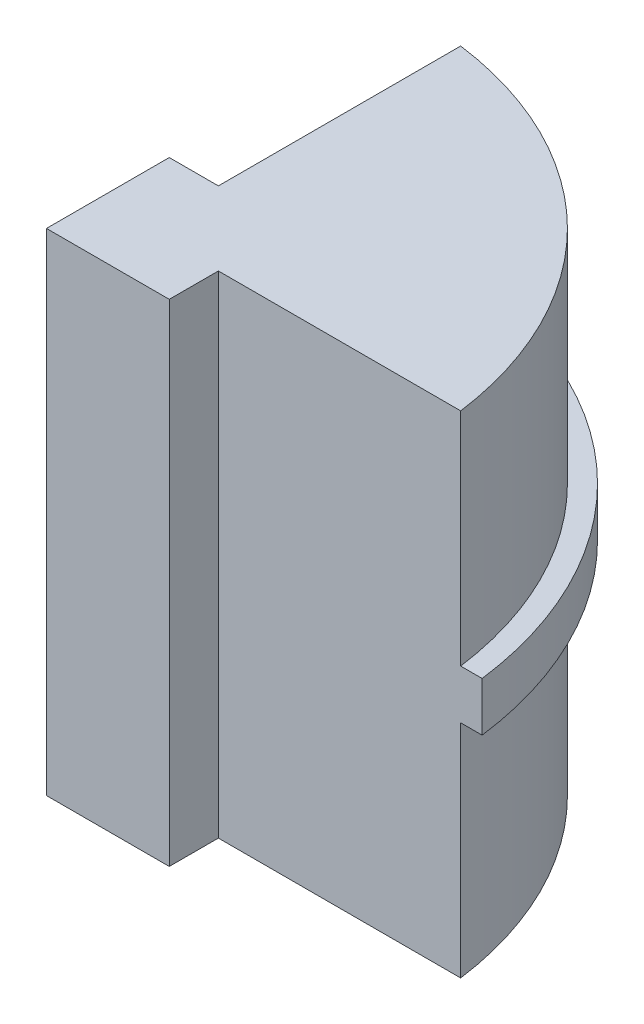
ISO-10303-21;
HEADER;
FILE_DESCRIPTION(('STEP AP214'),'2;1');
FILE_NAME('part.step','',(''),(''),'','','');
FILE_SCHEMA(('AUTOMOTIVE_DESIGN { 1 0 10303 214 1 1 1 1 }'));
ENDSEC;
DATA;
#1=APPLICATION_CONTEXT('core data for automotive mechanical design processes');
#2=APPLICATION_PROTOCOL_DEFINITION('international standard','automotive_design',2000,#1);
#3=PRODUCT_CONTEXT('',#1,'mechanical');
#4=PRODUCT('Part','Part','',(#3));
#5=PRODUCT_RELATED_PRODUCT_CATEGORY('part','',(#4));
#6=PRODUCT_DEFINITION_FORMATION('','',#4);
#7=PRODUCT_DEFINITION_CONTEXT('part definition',#1,'design');
#8=PRODUCT_DEFINITION('design','',#6,#7);
#9=PRODUCT_DEFINITION_SHAPE('','',#8);
#10=(LENGTH_UNIT() NAMED_UNIT(*) SI_UNIT(.MILLI.,.METRE.));
#11=(NAMED_UNIT(*) PLANE_ANGLE_UNIT() SI_UNIT($,.RADIAN.));
#12=(NAMED_UNIT(*) SI_UNIT($,.STERADIAN.) SOLID_ANGLE_UNIT());
#13=UNCERTAINTY_MEASURE_WITH_UNIT(LENGTH_MEASURE(1.E-05),#10,'distance_accuracy_value','');
#14=(GEOMETRIC_REPRESENTATION_CONTEXT(3) GLOBAL_UNCERTAINTY_ASSIGNED_CONTEXT((#13)) GLOBAL_UNIT_ASSIGNED_CONTEXT((#10,
#11,#12)) REPRESENTATION_CONTEXT('',''));
#15=CARTESIAN_POINT('',(0.,0.,0.));
#16=DIRECTION('',(0.,0.,1.));
#17=DIRECTION('',(1.,0.,0.));
#18=AXIS2_PLACEMENT_3D('',#15,#16,#17);
#19=CARTESIAN_POINT('',(-78.3830225784405,100.,48.6501613768879));
#20=DIRECTION('',(0.,-1.,0.));
#21=DIRECTION('',(0.,0.,-1.));
#22=AXIS2_PLACEMENT_3D('',#19,#20,#21);
#23=CYLINDRICAL_SURFACE('',#22,75.);
#24=CARTESIAN_POINT('',(-78.3830225784405,55.,48.6501613768879));
#25=DIRECTION('',(0.,1.,0.));
#26=DIRECTION('',(0.,0.,-1.));
#27=AXIS2_PLACEMENT_3D('',#24,#25,#26);
#28=CIRCLE('',#27,75.);
#29=CARTESIAN_POINT('',(-4.052678841848,55.,38.6501613768879));
#30=VERTEX_POINT('',#29);
#31=CARTESIAN_POINT('',(-68.3830225784405,55.,-25.6801823597046));
#32=VERTEX_POINT('',#31);
#33=EDGE_CURVE('E214',#30,#32,#28,.T.);
#34=ORIENTED_EDGE('',*,*,#33,.T.);
#35=DIRECTION('',(0.,-1.,0.));
#36=VECTOR('',#35,1.);
#37=CARTESIAN_POINT('',(-68.3830225784405,100.,-25.6801823597046));
#38=LINE('',#37,#36);
#39=CARTESIAN_POINT('',(-68.3830225784405,100.,-25.6801823597046));
#40=VERTEX_POINT('',#39);
#41=EDGE_CURVE('E154',#40,#32,#38,.T.);
#42=ORIENTED_EDGE('',*,*,#41,.F.);
#43=CARTESIAN_POINT('',(-78.3830225784405,100.,48.6501613768879));
#44=DIRECTION('',(0.,1.,0.));
#45=DIRECTION('',(0.,0.,1.));
#46=AXIS2_PLACEMENT_3D('',#43,#44,#45);
#47=CIRCLE('',#46,75.);
#48=CARTESIAN_POINT('',(-4.052678841848,100.,38.6501613768879));
#49=VERTEX_POINT('',#48);
#50=EDGE_CURVE('E114',#49,#40,#47,.T.);
#51=ORIENTED_EDGE('',*,*,#50,.F.);
#52=DIRECTION('',(0.,-1.,0.));
#53=VECTOR('',#52,1.);
#54=CARTESIAN_POINT('',(-4.052678841848,100.,38.6501613768879));
#55=LINE('',#54,#53);
#56=EDGE_CURVE('E157',#49,#30,#55,.T.);
#57=ORIENTED_EDGE('',*,*,#56,.T.);
#58=EDGE_LOOP('',(#34,#42,#51,#57));
#59=FACE_BOUND('',#58,.T.);
#60=ADVANCED_FACE('F32',(#59),#23,.T.);
#61=CARTESIAN_POINT('',(-78.3830225784405,100.,48.6501613768879));
#62=DIRECTION('',(0.,0.,-1.));
#63=DIRECTION('',(-1.,0.,0.));
#64=AXIS2_PLACEMENT_3D('',#61,#62,#63);
#65=PLANE('',#64);
#66=DIRECTION('',(1.,0.,0.));
#67=VECTOR('',#66,1.);
#68=CARTESIAN_POINT('',(-78.3830225784405,0.,48.6501613768879));
#69=LINE('',#68,#67);
#70=CARTESIAN_POINT('',(-78.3830225784405,0.,48.6501613768879));
#71=VERTEX_POINT('',#70);
#72=CARTESIAN_POINT('',(-53.3830225784405,0.,48.6501613768879));
#73=VERTEX_POINT('',#72);
#74=EDGE_CURVE('E135',#71,#73,#69,.T.);
#75=ORIENTED_EDGE('',*,*,#74,.T.);
#76=DIRECTION('',(0.,-1.,0.));
#77=VECTOR('',#76,1.);
#78=CARTESIAN_POINT('',(-53.3830225784405,100.,48.6501613768879));
#79=LINE('',#78,#77);
#80=CARTESIAN_POINT('',(-53.3830225784405,100.,48.6501613768879));
#81=VERTEX_POINT('',#80);
#82=EDGE_CURVE('E11',#81,#73,#79,.T.);
#83=ORIENTED_EDGE('',*,*,#82,.F.);
#84=DIRECTION('',(1.,0.,0.));
#85=VECTOR('',#84,1.);
#86=CARTESIAN_POINT('',(-78.3830225784405,100.,48.6501613768879));
#87=LINE('',#86,#85);
#88=CARTESIAN_POINT('',(-78.3830225784405,100.,48.6501613768879));
#89=VERTEX_POINT('',#88);
#90=EDGE_CURVE('E151',#89,#81,#87,.T.);
#91=ORIENTED_EDGE('',*,*,#90,.F.);
#92=DIRECTION('',(0.,-1.,0.));
#93=VECTOR('',#92,1.);
#94=CARTESIAN_POINT('',(-78.3830225784405,100.,48.6501613768879));
#95=LINE('',#94,#93);
#96=EDGE_CURVE('E131',#89,#71,#95,.T.);
#97=ORIENTED_EDGE('',*,*,#96,.T.);
#98=EDGE_LOOP('',(#75,#83,#91,#97));
#99=FACE_BOUND('',#98,.T.);
#100=ADVANCED_FACE('F34',(#99),#65,.F.);
#101=CARTESIAN_POINT('',(-53.3830225784405,100.,48.6501613768879));
#102=DIRECTION('',(-1.,0.,0.));
#103=DIRECTION('',(0.,0.,1.));
#104=AXIS2_PLACEMENT_3D('',#101,#102,#103);
#105=PLANE('',#104);
#106=DIRECTION('',(0.,0.,-1.));
#107=VECTOR('',#106,1.);
#108=CARTESIAN_POINT('',(-53.3830225784405,0.,48.6501613768879));
#109=LINE('',#108,#107);
#110=CARTESIAN_POINT('',(-53.3830225784405,0.,38.6501613768879));
#111=VERTEX_POINT('',#110);
#112=EDGE_CURVE('E138',#73,#111,#109,.T.);
#113=ORIENTED_EDGE('',*,*,#112,.T.);
#114=DIRECTION('',(0.,-1.,0.));
#115=VECTOR('',#114,1.);
#116=CARTESIAN_POINT('',(-53.3830225784405,100.,38.6501613768879));
#117=LINE('',#116,#115);
#118=CARTESIAN_POINT('',(-53.3830225784405,100.,38.6501613768879));
#119=VERTEX_POINT('',#118);
#120=EDGE_CURVE('E40',#119,#111,#117,.T.);
#121=ORIENTED_EDGE('',*,*,#120,.F.);
#122=DIRECTION('',(0.,0.,-1.));
#123=VECTOR('',#122,1.);
#124=CARTESIAN_POINT('',(-53.3830225784405,100.,48.6501613768879));
#125=LINE('',#124,#123);
#126=EDGE_CURVE('E94',#81,#119,#125,.T.);
#127=ORIENTED_EDGE('',*,*,#126,.F.);
#128=ORIENTED_EDGE('',*,*,#82,.T.);
#129=EDGE_LOOP('',(#113,#121,#127,#128));
#130=FACE_BOUND('',#129,.T.);
#131=ADVANCED_FACE('F238',(#130),#105,.F.);
#132=CARTESIAN_POINT('',(-53.3830225784405,100.,38.6501613768879));
#133=DIRECTION('',(0.,0.,-1.));
#134=DIRECTION('',(-1.,0.,0.));
#135=AXIS2_PLACEMENT_3D('',#132,#133,#134);
#136=PLANE('',#135);
#137=DIRECTION('',(1.,0.,0.));
#138=VECTOR('',#137,1.);
#139=CARTESIAN_POINT('',(-53.3830225784405,0.,38.6501613768879));
#140=LINE('',#139,#138);
#141=CARTESIAN_POINT('',(-4.052678841848,0.,38.6501613768879));
#142=VERTEX_POINT('',#141);
#143=EDGE_CURVE('E141',#111,#142,#140,.T.);
#144=ORIENTED_EDGE('',*,*,#143,.T.);
#145=CARTESIAN_POINT('',(-4.052678841848,45.,38.6501613768879));
#146=VERTEX_POINT('',#145);
#147=EDGE_CURVE('E156',#146,#142,#55,.T.);
#148=ORIENTED_EDGE('',*,*,#147,.F.);
#149=DIRECTION('',(-1.,0.,0.));
#150=VECTOR('',#149,1.);
#151=CARTESIAN_POINT('',(-4.052678841848,45.,38.6501613768879));
#152=LINE('',#151,#150);
#153=CARTESIAN_POINT('',(0.317026488455094,45.,38.6501613768879));
#154=VERTEX_POINT('',#153);
#155=EDGE_CURVE('E177',#154,#146,#152,.T.);
#156=ORIENTED_EDGE('',*,*,#155,.F.);
#157=DIRECTION('',(0.,1.,0.));
#158=VECTOR('',#157,1.);
#159=CARTESIAN_POINT('',(0.317026488455094,45.,38.6501613768879));
#160=LINE('',#159,#158);
#161=CARTESIAN_POINT('',(0.317026488455094,55.,38.6501613768879));
#162=VERTEX_POINT('',#161);
#163=EDGE_CURVE('E207',#154,#162,#160,.T.);
#164=ORIENTED_EDGE('',*,*,#163,.T.);
#165=DIRECTION('',(-1.,0.,0.));
#166=VECTOR('',#165,1.);
#167=CARTESIAN_POINT('',(-4.052678841848,55.,38.6501613768879));
#168=LINE('',#167,#166);
#169=EDGE_CURVE('E198',#162,#30,#168,.T.);
#170=ORIENTED_EDGE('',*,*,#169,.T.);
#171=ORIENTED_EDGE('',*,*,#56,.F.);
#172=DIRECTION('',(1.,0.,0.));
#173=VECTOR('',#172,1.);
#174=CARTESIAN_POINT('',(-53.3830225784405,100.,38.6501613768879));
#175=LINE('',#174,#173);
#176=EDGE_CURVE('E167',#119,#49,#175,.T.);
#177=ORIENTED_EDGE('',*,*,#176,.F.);
#178=ORIENTED_EDGE('',*,*,#120,.T.);
#179=EDGE_LOOP('',(#144,#148,#156,#164,#170,#171,#177,#178));
#180=FACE_BOUND('',#179,.T.);
#181=ADVANCED_FACE('F163',(#180),#136,.F.);
#182=CARTESIAN_POINT('',(-68.3830225784405,45.,-25.6801823597046));
#183=VERTEX_POINT('',#182);
#184=CARTESIAN_POINT('',(-68.3830225784405,0.,-25.6801823597046));
#185=VERTEX_POINT('',#184);
#186=EDGE_CURVE('E126',#183,#185,#38,.T.);
#187=ORIENTED_EDGE('',*,*,#186,.F.);
#188=CARTESIAN_POINT('',(-78.3830225784405,45.,48.6501613768879));
#189=DIRECTION('',(0.,1.,0.));
#190=DIRECTION('',(0.,0.,-1.));
#191=AXIS2_PLACEMENT_3D('',#188,#189,#190);
#192=CIRCLE('',#191,75.);
#193=EDGE_CURVE('E47',#146,#183,#192,.T.);
#194=ORIENTED_EDGE('',*,*,#193,.F.);
#195=ORIENTED_EDGE('',*,*,#147,.T.);
#196=CARTESIAN_POINT('',(-78.3830225784405,0.,48.6501613768879));
#197=DIRECTION('',(0.,1.,0.));
#198=DIRECTION('',(0.,0.,1.));
#199=AXIS2_PLACEMENT_3D('',#196,#197,#198);
#200=CIRCLE('',#199,75.);
#201=EDGE_CURVE('E144',#142,#185,#200,.T.);
#202=ORIENTED_EDGE('',*,*,#201,.T.);
#203=EDGE_LOOP('',(#187,#194,#195,#202));
#204=FACE_BOUND('',#203,.T.);
#205=ADVANCED_FACE('F173',(#204),#23,.T.);
#206=CARTESIAN_POINT('',(-68.3830225784405,100.,23.6501613768879));
#207=DIRECTION('',(1.,0.,0.));
#208=DIRECTION('',(0.,0.,-1.));
#209=AXIS2_PLACEMENT_3D('',#206,#207,#208);
#210=PLANE('',#209);
#211=DIRECTION('',(0.,0.,1.));
#212=VECTOR('',#211,1.);
#213=CARTESIAN_POINT('',(-68.3830225784405,0.,23.6501613768879));
#214=LINE('',#213,#212);
#215=CARTESIAN_POINT('',(-68.3830225784405,0.,23.6501613768879));
#216=VERTEX_POINT('',#215);
#217=EDGE_CURVE('E123',#185,#216,#214,.T.);
#218=ORIENTED_EDGE('',*,*,#217,.T.);
#219=DIRECTION('',(0.,-1.,0.));
#220=VECTOR('',#219,1.);
#221=CARTESIAN_POINT('',(-68.3830225784405,100.,23.6501613768879));
#222=LINE('',#221,#220);
#223=CARTESIAN_POINT('',(-68.3830225784405,100.,23.6501613768879));
#224=VERTEX_POINT('',#223);
#225=EDGE_CURVE('E120',#224,#216,#222,.T.);
#226=ORIENTED_EDGE('',*,*,#225,.F.);
#227=DIRECTION('',(0.,0.,1.));
#228=VECTOR('',#227,1.);
#229=CARTESIAN_POINT('',(-68.3830225784405,100.,23.6501613768879));
#230=LINE('',#229,#228);
#231=EDGE_CURVE('E107',#40,#224,#230,.T.);
#232=ORIENTED_EDGE('',*,*,#231,.F.);
#233=ORIENTED_EDGE('',*,*,#41,.T.);
#234=DIRECTION('',(0.,0.,-1.));
#235=VECTOR('',#234,1.);
#236=CARTESIAN_POINT('',(-68.3830225784405,55.,-25.6801823597046));
#237=LINE('',#236,#235);
#238=CARTESIAN_POINT('',(-68.3830225784405,55.,-30.0498876900077));
#239=VERTEX_POINT('',#238);
#240=EDGE_CURVE('E206',#32,#239,#237,.T.);
#241=ORIENTED_EDGE('',*,*,#240,.T.);
#242=DIRECTION('',(0.,1.,0.));
#243=VECTOR('',#242,1.);
#244=CARTESIAN_POINT('',(-68.3830225784405,45.,-30.0498876900077));
#245=LINE('',#244,#243);
#246=CARTESIAN_POINT('',(-68.3830225784405,45.,-30.0498876900077));
#247=VERTEX_POINT('',#246);
#248=EDGE_CURVE('E139',#247,#239,#245,.T.);
#249=ORIENTED_EDGE('',*,*,#248,.F.);
#250=DIRECTION('',(0.,0.,-1.));
#251=VECTOR('',#250,1.);
#252=CARTESIAN_POINT('',(-68.3830225784405,45.,-25.6801823597046));
#253=LINE('',#252,#251);
#254=EDGE_CURVE('E200',#183,#247,#253,.T.);
#255=ORIENTED_EDGE('',*,*,#254,.F.);
#256=ORIENTED_EDGE('',*,*,#186,.T.);
#257=EDGE_LOOP('',(#218,#226,#232,#233,#241,#249,#255,#256));
#258=FACE_BOUND('',#257,.T.);
#259=ADVANCED_FACE('F121',(#258),#210,.F.);
#260=CARTESIAN_POINT('',(-78.3830225784405,100.,23.6501613768879));
#261=DIRECTION('',(0.,0.,1.));
#262=DIRECTION('',(1.,0.,0.));
#263=AXIS2_PLACEMENT_3D('',#260,#261,#262);
#264=PLANE('',#263);
#265=DIRECTION('',(-1.,0.,0.));
#266=VECTOR('',#265,1.);
#267=CARTESIAN_POINT('',(-78.3830225784405,0.,23.6501613768879));
#268=LINE('',#267,#266);
#269=CARTESIAN_POINT('',(-78.3830225784405,0.,23.6501613768879));
#270=VERTEX_POINT('',#269);
#271=EDGE_CURVE('E148',#216,#270,#268,.T.);
#272=ORIENTED_EDGE('',*,*,#271,.T.);
#273=DIRECTION('',(0.,-1.,0.));
#274=VECTOR('',#273,1.);
#275=CARTESIAN_POINT('',(-78.3830225784405,100.,23.6501613768879));
#276=LINE('',#275,#274);
#277=CARTESIAN_POINT('',(-78.3830225784405,100.,23.6501613768879));
#278=VERTEX_POINT('',#277);
#279=EDGE_CURVE('E127',#278,#270,#276,.T.);
#280=ORIENTED_EDGE('',*,*,#279,.F.);
#281=DIRECTION('',(-1.,0.,0.));
#282=VECTOR('',#281,1.);
#283=CARTESIAN_POINT('',(-78.3830225784405,100.,23.6501613768879));
#284=LINE('',#283,#282);
#285=EDGE_CURVE('E111',#224,#278,#284,.T.);
#286=ORIENTED_EDGE('',*,*,#285,.F.);
#287=ORIENTED_EDGE('',*,*,#225,.T.);
#288=EDGE_LOOP('',(#272,#280,#286,#287));
#289=FACE_BOUND('',#288,.T.);
#290=ADVANCED_FACE('F129',(#289),#264,.F.);
#291=CARTESIAN_POINT('',(-78.3830225784405,100.,48.6501613768879));
#292=DIRECTION('',(1.,0.,0.));
#293=DIRECTION('',(0.,0.,-1.));
#294=AXIS2_PLACEMENT_3D('',#291,#292,#293);
#295=PLANE('',#294);
#296=DIRECTION('',(0.,0.,1.));
#297=VECTOR('',#296,1.);
#298=CARTESIAN_POINT('',(-78.3830225784405,0.,48.6501613768879));
#299=LINE('',#298,#297);
#300=EDGE_CURVE('E86',#270,#71,#299,.T.);
#301=ORIENTED_EDGE('',*,*,#300,.T.);
#302=ORIENTED_EDGE('',*,*,#96,.F.);
#303=DIRECTION('',(0.,0.,1.));
#304=VECTOR('',#303,1.);
#305=CARTESIAN_POINT('',(-78.3830225784405,100.,48.6501613768879));
#306=LINE('',#305,#304);
#307=EDGE_CURVE('E56',#278,#89,#306,.T.);
#308=ORIENTED_EDGE('',*,*,#307,.F.);
#309=ORIENTED_EDGE('',*,*,#279,.T.);
#310=EDGE_LOOP('',(#301,#302,#308,#309));
#311=FACE_BOUND('',#310,.T.);
#312=ADVANCED_FACE('F254',(#311),#295,.F.);
#313=CARTESIAN_POINT('',(-78.3830225784405,100.,48.6501613768879));
#314=DIRECTION('',(0.,1.,0.));
#315=DIRECTION('',(0.,0.,1.));
#316=AXIS2_PLACEMENT_3D('',#313,#314,#315);
#317=PLANE('',#316);
#318=ORIENTED_EDGE('',*,*,#90,.T.);
#319=ORIENTED_EDGE('',*,*,#126,.T.);
#320=ORIENTED_EDGE('',*,*,#176,.T.);
#321=ORIENTED_EDGE('',*,*,#50,.T.);
#322=ORIENTED_EDGE('',*,*,#231,.T.);
#323=ORIENTED_EDGE('',*,*,#285,.T.);
#324=ORIENTED_EDGE('',*,*,#307,.T.);
#325=EDGE_LOOP('',(#318,#319,#320,#321,#322,#323,#324));
#326=FACE_BOUND('',#325,.T.);
#327=ADVANCED_FACE('F109',(#326),#317,.T.);
#328=CARTESIAN_POINT('',(-78.3830225784405,0.,48.6501613768879));
#329=DIRECTION('',(0.,1.,0.));
#330=DIRECTION('',(0.,0.,1.));
#331=AXIS2_PLACEMENT_3D('',#328,#329,#330);
#332=PLANE('',#331);
#333=ORIENTED_EDGE('',*,*,#74,.F.);
#334=ORIENTED_EDGE('',*,*,#300,.F.);
#335=ORIENTED_EDGE('',*,*,#271,.F.);
#336=ORIENTED_EDGE('',*,*,#217,.F.);
#337=ORIENTED_EDGE('',*,*,#201,.F.);
#338=ORIENTED_EDGE('',*,*,#143,.F.);
#339=ORIENTED_EDGE('',*,*,#112,.F.);
#340=EDGE_LOOP('',(#333,#334,#335,#336,#337,#338,#339));
#341=FACE_BOUND('',#340,.T.);
#342=ADVANCED_FACE('F170',(#341),#332,.F.);
#343=CARTESIAN_POINT('',(-78.3830225784405,45.,48.6501613768879));
#344=DIRECTION('',(0.,1.,0.));
#345=DIRECTION('',(0.,0.,1.));
#346=AXIS2_PLACEMENT_3D('',#343,#344,#345);
#347=CYLINDRICAL_SURFACE('',#346,79.3328287856407);
#348=CARTESIAN_POINT('',(-78.3830225784405,55.,48.6501613768879));
#349=DIRECTION('',(0.,-1.,0.));
#350=DIRECTION('',(0.,0.,-1.));
#351=AXIS2_PLACEMENT_3D('',#348,#349,#350);
#352=CIRCLE('',#351,79.3328287856407);
#353=EDGE_CURVE('E195',#239,#162,#352,.T.);
#354=ORIENTED_EDGE('',*,*,#353,.T.);
#355=ORIENTED_EDGE('',*,*,#163,.F.);
#356=CARTESIAN_POINT('',(-78.3830225784405,45.,48.6501613768879));
#357=DIRECTION('',(0.,-1.,0.));
#358=DIRECTION('',(0.,0.,-1.));
#359=AXIS2_PLACEMENT_3D('',#356,#357,#358);
#360=CIRCLE('',#359,79.3328287856407);
#361=EDGE_CURVE('E204',#247,#154,#360,.T.);
#362=ORIENTED_EDGE('',*,*,#361,.F.);
#363=ORIENTED_EDGE('',*,*,#248,.T.);
#364=EDGE_LOOP('',(#354,#355,#362,#363));
#365=FACE_BOUND('',#364,.T.);
#366=ADVANCED_FACE('F209',(#365),#347,.T.);
#367=CARTESIAN_POINT('',(-78.3830225784405,45.,48.6501613768879));
#368=DIRECTION('',(0.,-1.,0.));
#369=DIRECTION('',(0.,0.,-1.));
#370=AXIS2_PLACEMENT_3D('',#367,#368,#369);
#371=PLANE('',#370);
#372=ORIENTED_EDGE('',*,*,#193,.T.);
#373=ORIENTED_EDGE('',*,*,#254,.T.);
#374=ORIENTED_EDGE('',*,*,#361,.T.);
#375=ORIENTED_EDGE('',*,*,#155,.T.);
#376=EDGE_LOOP('',(#372,#373,#374,#375));
#377=FACE_BOUND('',#376,.T.);
#378=ADVANCED_FACE('F202',(#377),#371,.T.);
#379=CARTESIAN_POINT('',(-78.3830225784405,55.,48.6501613768879));
#380=DIRECTION('',(0.,-1.,0.));
#381=DIRECTION('',(0.,0.,-1.));
#382=AXIS2_PLACEMENT_3D('',#379,#380,#381);
#383=PLANE('',#382);
#384=ORIENTED_EDGE('',*,*,#33,.F.);
#385=ORIENTED_EDGE('',*,*,#169,.F.);
#386=ORIENTED_EDGE('',*,*,#353,.F.);
#387=ORIENTED_EDGE('',*,*,#240,.F.);
#388=EDGE_LOOP('',(#384,#385,#386,#387));
#389=FACE_BOUND('',#388,.T.);
#390=ADVANCED_FACE('F225',(#389),#383,.F.);
#391=CLOSED_SHELL('',(#60,#100,#131,#181,#205,#259,#290,#312,#327,#342,#366,#378,#390));
#392=MANIFOLD_SOLID_BREP('B2',#391);
#393=ADVANCED_BREP_SHAPE_REPRESENTATION('',(#18,#392),#14);
#394=SHAPE_DEFINITION_REPRESENTATION(#9,#393);
ENDSEC;
END-ISO-10303-21;
